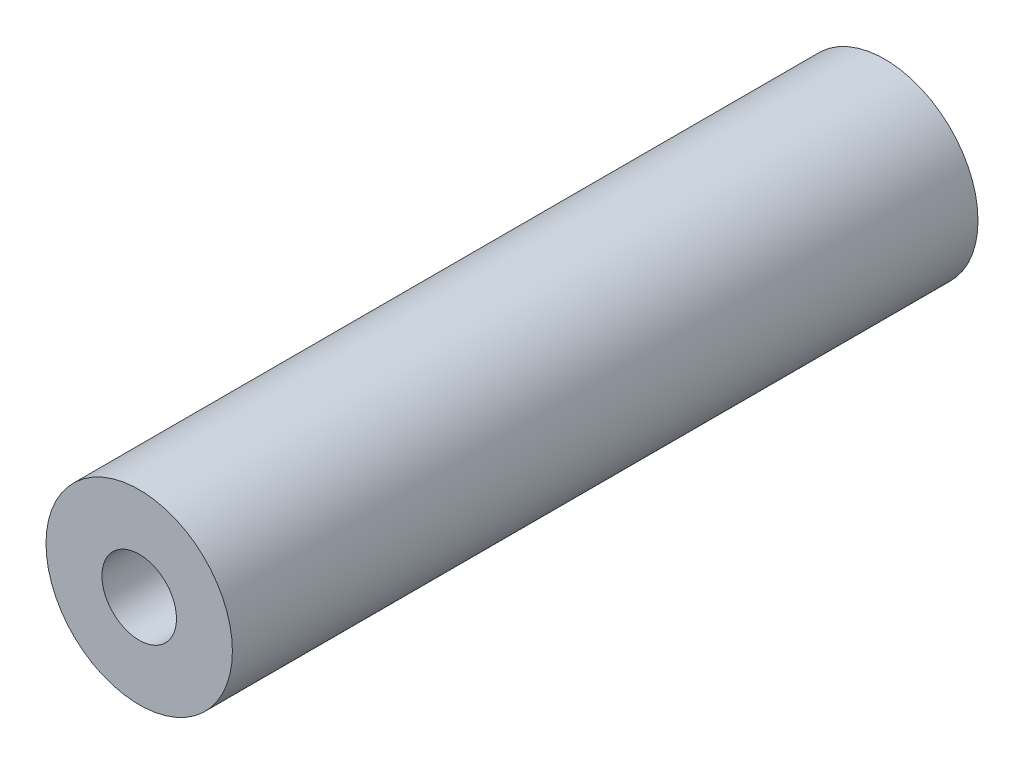
ISO-10303-21;
HEADER;
FILE_DESCRIPTION(('STEP AP214'),'2;1');
FILE_NAME('part.step','',(''),(''),'','','');
FILE_SCHEMA(('AUTOMOTIVE_DESIGN { 1 0 10303 214 1 1 1 1 }'));
ENDSEC;
DATA;
#1=APPLICATION_CONTEXT('core data for automotive mechanical design processes');
#2=APPLICATION_PROTOCOL_DEFINITION('international standard','automotive_design',2000,#1);
#3=PRODUCT_CONTEXT('',#1,'mechanical');
#4=PRODUCT('Part','Part','',(#3));
#5=PRODUCT_RELATED_PRODUCT_CATEGORY('part','',(#4));
#6=PRODUCT_DEFINITION_FORMATION('','',#4);
#7=PRODUCT_DEFINITION_CONTEXT('part definition',#1,'design');
#8=PRODUCT_DEFINITION('design','',#6,#7);
#9=PRODUCT_DEFINITION_SHAPE('','',#8);
#10=(LENGTH_UNIT() NAMED_UNIT(*) SI_UNIT(.MILLI.,.METRE.));
#11=(NAMED_UNIT(*) PLANE_ANGLE_UNIT() SI_UNIT($,.RADIAN.));
#12=(NAMED_UNIT(*) SI_UNIT($,.STERADIAN.) SOLID_ANGLE_UNIT());
#13=UNCERTAINTY_MEASURE_WITH_UNIT(LENGTH_MEASURE(1.E-05),#10,'distance_accuracy_value','');
#14=(GEOMETRIC_REPRESENTATION_CONTEXT(3) GLOBAL_UNCERTAINTY_ASSIGNED_CONTEXT((#13)) GLOBAL_UNIT_ASSIGNED_CONTEXT((#10,
#11,#12)) REPRESENTATION_CONTEXT('',''));
#15=CARTESIAN_POINT('',(0.,0.,0.));
#16=DIRECTION('',(0.,0.,1.));
#17=DIRECTION('',(1.,0.,0.));
#18=AXIS2_PLACEMENT_3D('',#15,#16,#17);
#19=CARTESIAN_POINT('',(0.,0.,32.));
#20=DIRECTION('',(0.,0.,1.));
#21=DIRECTION('',(1.,0.,0.));
#22=AXIS2_PLACEMENT_3D('',#19,#20,#21);
#23=PLANE('',#22);
#24=CARTESIAN_POINT('',(0.,0.,32.));
#25=DIRECTION('',(0.,0.,1.));
#26=DIRECTION('',(1.,0.,0.));
#27=AXIS2_PLACEMENT_3D('',#24,#25,#26);
#28=CIRCLE('',#27,4.);
#29=CARTESIAN_POINT('',(4.,0.,32.));
#30=VERTEX_POINT('',#29);
#31=EDGE_CURVE('E10',#30,#30,#28,.T.);
#32=ORIENTED_EDGE('',*,*,#31,.T.);
#33=EDGE_LOOP('',(#32));
#34=FACE_BOUND('',#33,.T.);
#35=CARTESIAN_POINT('',(0.,0.,32.));
#36=DIRECTION('',(0.,0.,1.));
#37=DIRECTION('',(1.,0.,0.));
#38=AXIS2_PLACEMENT_3D('',#35,#36,#37);
#39=CIRCLE('',#38,1.6);
#40=CARTESIAN_POINT('',(1.6,0.,32.));
#41=VERTEX_POINT('',#40);
#42=EDGE_CURVE('E57',#41,#41,#39,.T.);
#43=ORIENTED_EDGE('',*,*,#42,.F.);
#44=EDGE_LOOP('',(#43));
#45=FACE_BOUND('',#44,.T.);
#46=ADVANCED_FACE('F43',(#34,#45),#23,.T.);
#47=CARTESIAN_POINT('',(0.,0.,0.));
#48=DIRECTION('',(0.,0.,1.));
#49=DIRECTION('',(1.,0.,0.));
#50=AXIS2_PLACEMENT_3D('',#47,#48,#49);
#51=PLANE('',#50);
#52=CARTESIAN_POINT('',(0.,0.,0.));
#53=DIRECTION('',(0.,0.,1.));
#54=DIRECTION('',(1.,0.,0.));
#55=AXIS2_PLACEMENT_3D('',#52,#53,#54);
#56=CIRCLE('',#55,4.);
#57=CARTESIAN_POINT('',(4.,0.,0.));
#58=VERTEX_POINT('',#57);
#59=EDGE_CURVE('E50',#58,#58,#56,.T.);
#60=ORIENTED_EDGE('',*,*,#59,.F.);
#61=EDGE_LOOP('',(#60));
#62=FACE_BOUND('',#61,.T.);
#63=CARTESIAN_POINT('',(0.,0.,0.));
#64=DIRECTION('',(0.,0.,1.));
#65=DIRECTION('',(1.,0.,0.));
#66=AXIS2_PLACEMENT_3D('',#63,#64,#65);
#67=CIRCLE('',#66,1.6);
#68=CARTESIAN_POINT('',(1.6,0.,0.));
#69=VERTEX_POINT('',#68);
#70=EDGE_CURVE('E59',#69,#69,#67,.T.);
#71=ORIENTED_EDGE('',*,*,#70,.T.);
#72=EDGE_LOOP('',(#71));
#73=FACE_BOUND('',#72,.T.);
#74=ADVANCED_FACE('F70',(#62,#73),#51,.F.);
#75=CARTESIAN_POINT('',(0.,0.,32.));
#76=DIRECTION('',(0.,0.,-1.));
#77=DIRECTION('',(-1.,0.,0.));
#78=AXIS2_PLACEMENT_3D('',#75,#76,#77);
#79=CYLINDRICAL_SURFACE('',#78,4.);
#80=ORIENTED_EDGE('',*,*,#31,.F.);
#81=EDGE_LOOP('',(#80));
#82=FACE_BOUND('',#81,.T.);
#83=ORIENTED_EDGE('',*,*,#59,.T.);
#84=EDGE_LOOP('',(#83));
#85=FACE_BOUND('',#84,.T.);
#86=ADVANCED_FACE('F44',(#82,#85),#79,.T.);
#87=CARTESIAN_POINT('',(0.,0.,32.));
#88=DIRECTION('',(0.,0.,-1.));
#89=DIRECTION('',(-1.,0.,0.));
#90=AXIS2_PLACEMENT_3D('',#87,#88,#89);
#91=CYLINDRICAL_SURFACE('',#90,1.6);
#92=ORIENTED_EDGE('',*,*,#42,.T.);
#93=EDGE_LOOP('',(#92));
#94=FACE_BOUND('',#93,.T.);
#95=ORIENTED_EDGE('',*,*,#70,.F.);
#96=EDGE_LOOP('',(#95));
#97=FACE_BOUND('',#96,.T.);
#98=ADVANCED_FACE('F66',(#94,#97),#91,.F.);
#99=CLOSED_SHELL('',(#46,#74,#86,#98));
#100=MANIFOLD_SOLID_BREP('B2',#99);
#101=ADVANCED_BREP_SHAPE_REPRESENTATION('',(#18,#100),#14);
#102=SHAPE_DEFINITION_REPRESENTATION(#9,#101);
ENDSEC;
END-ISO-10303-21;
